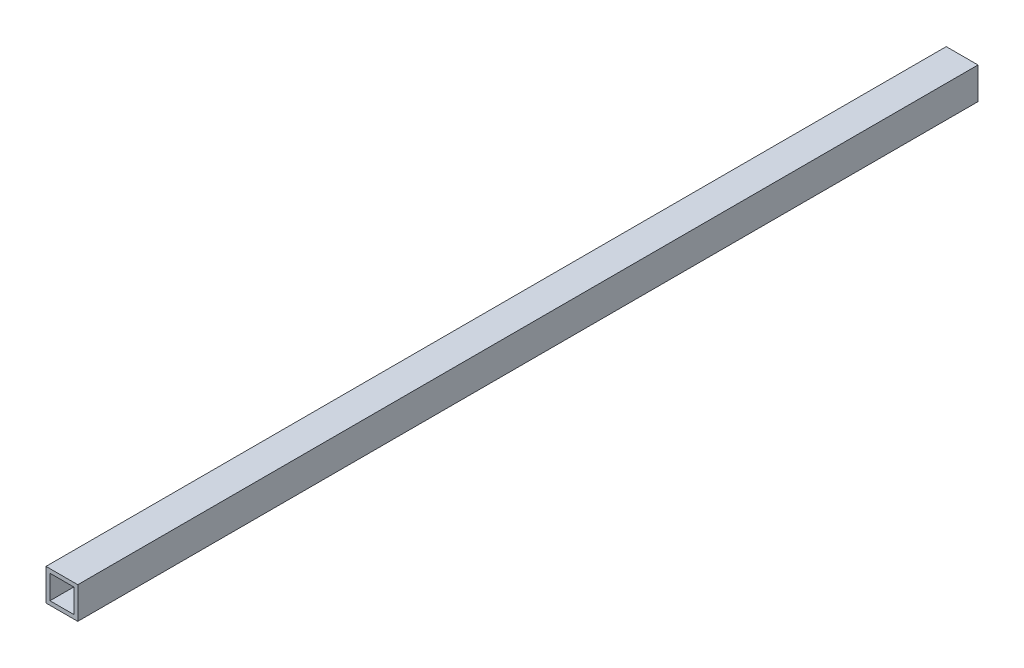
ISO-10303-21;
HEADER;
FILE_DESCRIPTION(('STEP AP214'),'2;1');
FILE_NAME('part.step','',(''),(''),'','','');
FILE_SCHEMA(('AUTOMOTIVE_DESIGN { 1 0 10303 214 1 1 1 1 }'));
ENDSEC;
DATA;
#1=APPLICATION_CONTEXT('core data for automotive mechanical design processes');
#2=APPLICATION_PROTOCOL_DEFINITION('international standard','automotive_design',2000,#1);
#3=PRODUCT_CONTEXT('',#1,'mechanical');
#4=PRODUCT('Part','Part','',(#3));
#5=PRODUCT_RELATED_PRODUCT_CATEGORY('part','',(#4));
#6=PRODUCT_DEFINITION_FORMATION('','',#4);
#7=PRODUCT_DEFINITION_CONTEXT('part definition',#1,'design');
#8=PRODUCT_DEFINITION('design','',#6,#7);
#9=PRODUCT_DEFINITION_SHAPE('','',#8);
#10=(LENGTH_UNIT() NAMED_UNIT(*) SI_UNIT(.MILLI.,.METRE.));
#11=(NAMED_UNIT(*) PLANE_ANGLE_UNIT() SI_UNIT($,.RADIAN.));
#12=(NAMED_UNIT(*) SI_UNIT($,.STERADIAN.) SOLID_ANGLE_UNIT());
#13=UNCERTAINTY_MEASURE_WITH_UNIT(LENGTH_MEASURE(1.E-05),#10,'distance_accuracy_value','');
#14=(GEOMETRIC_REPRESENTATION_CONTEXT(3) GLOBAL_UNCERTAINTY_ASSIGNED_CONTEXT((#13)) GLOBAL_UNIT_ASSIGNED_CONTEXT((#10,
#11,#12)) REPRESENTATION_CONTEXT('',''));
#15=CARTESIAN_POINT('',(0.,0.,0.));
#16=DIRECTION('',(0.,0.,1.));
#17=DIRECTION('',(1.,0.,0.));
#18=AXIS2_PLACEMENT_3D('',#15,#16,#17);
#19=CARTESIAN_POINT('',(6.,6.,340.));
#20=DIRECTION('',(-1.,0.,0.));
#21=DIRECTION('',(0.,-1.,0.));
#22=AXIS2_PLACEMENT_3D('',#19,#20,#21);
#23=PLANE('',#22);
#24=DIRECTION('',(0.,1.,0.));
#25=VECTOR('',#24,1.);
#26=CARTESIAN_POINT('',(6.,6.,0.));
#27=LINE('',#26,#25);
#28=CARTESIAN_POINT('',(6.,-6.,0.));
#29=VERTEX_POINT('',#28);
#30=CARTESIAN_POINT('',(6.,6.,0.));
#31=VERTEX_POINT('',#30);
#32=EDGE_CURVE('E149',#29,#31,#27,.T.);
#33=ORIENTED_EDGE('',*,*,#32,.T.);
#34=DIRECTION('',(0.,0.,-1.));
#35=VECTOR('',#34,1.);
#36=CARTESIAN_POINT('',(6.,6.,340.));
#37=LINE('',#36,#35);
#38=CARTESIAN_POINT('',(6.,6.,340.));
#39=VERTEX_POINT('',#38);
#40=EDGE_CURVE('E11',#39,#31,#37,.T.);
#41=ORIENTED_EDGE('',*,*,#40,.F.);
#42=DIRECTION('',(0.,1.,0.));
#43=VECTOR('',#42,1.);
#44=CARTESIAN_POINT('',(6.,6.,340.));
#45=LINE('',#44,#43);
#46=CARTESIAN_POINT('',(6.,-6.,340.));
#47=VERTEX_POINT('',#46);
#48=EDGE_CURVE('E138',#47,#39,#45,.T.);
#49=ORIENTED_EDGE('',*,*,#48,.F.);
#50=DIRECTION('',(0.,0.,-1.));
#51=VECTOR('',#50,1.);
#52=CARTESIAN_POINT('',(6.,-6.,340.));
#53=LINE('',#52,#51);
#54=EDGE_CURVE('E148',#47,#29,#53,.T.);
#55=ORIENTED_EDGE('',*,*,#54,.T.);
#56=EDGE_LOOP('',(#33,#41,#49,#55));
#57=FACE_BOUND('',#56,.T.);
#58=ADVANCED_FACE('F41',(#57),#23,.F.);
#59=CARTESIAN_POINT('',(-6.,6.,340.));
#60=DIRECTION('',(0.,-1.,0.));
#61=DIRECTION('',(0.,0.,-1.));
#62=AXIS2_PLACEMENT_3D('',#59,#60,#61);
#63=PLANE('',#62);
#64=DIRECTION('',(-1.,0.,0.));
#65=VECTOR('',#64,1.);
#66=CARTESIAN_POINT('',(-6.,6.,0.));
#67=LINE('',#66,#65);
#68=CARTESIAN_POINT('',(-6.,6.,0.));
#69=VERTEX_POINT('',#68);
#70=EDGE_CURVE('E152',#31,#69,#67,.T.);
#71=ORIENTED_EDGE('',*,*,#70,.T.);
#72=DIRECTION('',(0.,0.,-1.));
#73=VECTOR('',#72,1.);
#74=CARTESIAN_POINT('',(-6.,6.,340.));
#75=LINE('',#74,#73);
#76=CARTESIAN_POINT('',(-6.,6.,340.));
#77=VERTEX_POINT('',#76);
#78=EDGE_CURVE('E48',#77,#69,#75,.T.);
#79=ORIENTED_EDGE('',*,*,#78,.F.);
#80=DIRECTION('',(-1.,0.,0.));
#81=VECTOR('',#80,1.);
#82=CARTESIAN_POINT('',(-6.,6.,340.));
#83=LINE('',#82,#81);
#84=EDGE_CURVE('E141',#39,#77,#83,.T.);
#85=ORIENTED_EDGE('',*,*,#84,.F.);
#86=ORIENTED_EDGE('',*,*,#40,.T.);
#87=EDGE_LOOP('',(#71,#79,#85,#86));
#88=FACE_BOUND('',#87,.T.);
#89=ADVANCED_FACE('F180',(#88),#63,.F.);
#90=CARTESIAN_POINT('',(-6.,6.,340.));
#91=DIRECTION('',(1.,0.,0.));
#92=DIRECTION('',(0.,1.,0.));
#93=AXIS2_PLACEMENT_3D('',#90,#91,#92);
#94=PLANE('',#93);
#95=DIRECTION('',(0.,-1.,0.));
#96=VECTOR('',#95,1.);
#97=CARTESIAN_POINT('',(-6.,6.,0.));
#98=LINE('',#97,#96);
#99=CARTESIAN_POINT('',(-6.,-6.,0.));
#100=VERTEX_POINT('',#99);
#101=EDGE_CURVE('E154',#69,#100,#98,.T.);
#102=ORIENTED_EDGE('',*,*,#101,.T.);
#103=DIRECTION('',(0.,0.,-1.));
#104=VECTOR('',#103,1.);
#105=CARTESIAN_POINT('',(-6.,-6.,340.));
#106=LINE('',#105,#104);
#107=CARTESIAN_POINT('',(-6.,-6.,340.));
#108=VERTEX_POINT('',#107);
#109=EDGE_CURVE('E159',#108,#100,#106,.T.);
#110=ORIENTED_EDGE('',*,*,#109,.F.);
#111=DIRECTION('',(0.,-1.,0.));
#112=VECTOR('',#111,1.);
#113=CARTESIAN_POINT('',(-6.,6.,340.));
#114=LINE('',#113,#112);
#115=EDGE_CURVE('E144',#77,#108,#114,.T.);
#116=ORIENTED_EDGE('',*,*,#115,.F.);
#117=ORIENTED_EDGE('',*,*,#78,.T.);
#118=EDGE_LOOP('',(#102,#110,#116,#117));
#119=FACE_BOUND('',#118,.T.);
#120=ADVANCED_FACE('F166',(#119),#94,.F.);
#121=CARTESIAN_POINT('',(-6.,-6.,340.));
#122=DIRECTION('',(0.,1.,0.));
#123=DIRECTION('',(0.,0.,1.));
#124=AXIS2_PLACEMENT_3D('',#121,#122,#123);
#125=PLANE('',#124);
#126=DIRECTION('',(1.,0.,0.));
#127=VECTOR('',#126,1.);
#128=CARTESIAN_POINT('',(-6.,-6.,0.));
#129=LINE('',#128,#127);
#130=EDGE_CURVE('E142',#100,#29,#129,.T.);
#131=ORIENTED_EDGE('',*,*,#130,.T.);
#132=ORIENTED_EDGE('',*,*,#54,.F.);
#133=DIRECTION('',(1.,0.,0.));
#134=VECTOR('',#133,1.);
#135=CARTESIAN_POINT('',(-6.,-6.,340.));
#136=LINE('',#135,#134);
#137=EDGE_CURVE('E146',#108,#47,#136,.T.);
#138=ORIENTED_EDGE('',*,*,#137,.F.);
#139=ORIENTED_EDGE('',*,*,#109,.T.);
#140=EDGE_LOOP('',(#131,#132,#138,#139));
#141=FACE_BOUND('',#140,.T.);
#142=ADVANCED_FACE('F173',(#141),#125,.F.);
#143=CARTESIAN_POINT('',(0.,0.,340.));
#144=DIRECTION('',(0.,0.,1.));
#145=DIRECTION('',(1.,0.,0.));
#146=AXIS2_PLACEMENT_3D('',#143,#144,#145);
#147=PLANE('',#146);
#148=DIRECTION('',(0.,1.,0.));
#149=VECTOR('',#148,1.);
#150=CARTESIAN_POINT('',(4.5,6.,340.));
#151=LINE('',#150,#149);
#152=CARTESIAN_POINT('',(4.5,-4.5,340.));
#153=VERTEX_POINT('',#152);
#154=CARTESIAN_POINT('',(4.5,4.5,340.));
#155=VERTEX_POINT('',#154);
#156=EDGE_CURVE('E126',#153,#155,#151,.T.);
#157=ORIENTED_EDGE('',*,*,#156,.F.);
#158=DIRECTION('',(1.,0.,0.));
#159=VECTOR('',#158,1.);
#160=CARTESIAN_POINT('',(-6.,-4.5,340.));
#161=LINE('',#160,#159);
#162=CARTESIAN_POINT('',(-4.5,-4.5,340.));
#163=VERTEX_POINT('',#162);
#164=EDGE_CURVE('E110',#163,#153,#161,.T.);
#165=ORIENTED_EDGE('',*,*,#164,.F.);
#166=DIRECTION('',(0.,-1.,0.));
#167=VECTOR('',#166,1.);
#168=CARTESIAN_POINT('',(-4.5,6.,340.));
#169=LINE('',#168,#167);
#170=CARTESIAN_POINT('',(-4.5,4.5,340.));
#171=VERTEX_POINT('',#170);
#172=EDGE_CURVE('E135',#171,#163,#169,.T.);
#173=ORIENTED_EDGE('',*,*,#172,.F.);
#174=DIRECTION('',(-1.,0.,0.));
#175=VECTOR('',#174,1.);
#176=CARTESIAN_POINT('',(-6.,4.5,340.));
#177=LINE('',#176,#175);
#178=EDGE_CURVE('E128',#155,#171,#177,.T.);
#179=ORIENTED_EDGE('',*,*,#178,.F.);
#180=EDGE_LOOP('',(#157,#165,#173,#179));
#181=FACE_BOUND('',#180,.T.);
#182=ORIENTED_EDGE('',*,*,#48,.T.);
#183=ORIENTED_EDGE('',*,*,#84,.T.);
#184=ORIENTED_EDGE('',*,*,#115,.T.);
#185=ORIENTED_EDGE('',*,*,#137,.T.);
#186=EDGE_LOOP('',(#182,#183,#184,#185));
#187=FACE_BOUND('',#186,.T.);
#188=ADVANCED_FACE('F179',(#181,#187),#147,.T.);
#189=CARTESIAN_POINT('',(0.,0.,0.));
#190=DIRECTION('',(0.,0.,1.));
#191=DIRECTION('',(1.,0.,0.));
#192=AXIS2_PLACEMENT_3D('',#189,#190,#191);
#193=PLANE('',#192);
#194=DIRECTION('',(1.,0.,0.));
#195=VECTOR('',#194,1.);
#196=CARTESIAN_POINT('',(-6.,-4.5,0.));
#197=LINE('',#196,#195);
#198=CARTESIAN_POINT('',(-4.5,-4.5,0.));
#199=VERTEX_POINT('',#198);
#200=CARTESIAN_POINT('',(4.5,-4.5,0.));
#201=VERTEX_POINT('',#200);
#202=EDGE_CURVE('E108',#199,#201,#197,.T.);
#203=ORIENTED_EDGE('',*,*,#202,.T.);
#204=DIRECTION('',(0.,1.,0.));
#205=VECTOR('',#204,1.);
#206=CARTESIAN_POINT('',(4.5,6.,0.));
#207=LINE('',#206,#205);
#208=CARTESIAN_POINT('',(4.5,4.5,0.));
#209=VERTEX_POINT('',#208);
#210=EDGE_CURVE('E116',#201,#209,#207,.T.);
#211=ORIENTED_EDGE('',*,*,#210,.T.);
#212=DIRECTION('',(-1.,0.,0.));
#213=VECTOR('',#212,1.);
#214=CARTESIAN_POINT('',(-6.,4.5,0.));
#215=LINE('',#214,#213);
#216=CARTESIAN_POINT('',(-4.5,4.5,0.));
#217=VERTEX_POINT('',#216);
#218=EDGE_CURVE('E122',#209,#217,#215,.T.);
#219=ORIENTED_EDGE('',*,*,#218,.T.);
#220=DIRECTION('',(0.,-1.,0.));
#221=VECTOR('',#220,1.);
#222=CARTESIAN_POINT('',(-4.5,6.,0.));
#223=LINE('',#222,#221);
#224=EDGE_CURVE('E62',#217,#199,#223,.T.);
#225=ORIENTED_EDGE('',*,*,#224,.T.);
#226=EDGE_LOOP('',(#203,#211,#219,#225));
#227=FACE_BOUND('',#226,.T.);
#228=ORIENTED_EDGE('',*,*,#32,.F.);
#229=ORIENTED_EDGE('',*,*,#130,.F.);
#230=ORIENTED_EDGE('',*,*,#101,.F.);
#231=ORIENTED_EDGE('',*,*,#70,.F.);
#232=EDGE_LOOP('',(#228,#229,#230,#231));
#233=FACE_BOUND('',#232,.T.);
#234=ADVANCED_FACE('F124',(#227,#233),#193,.F.);
#235=CARTESIAN_POINT('',(4.5,6.,340.));
#236=DIRECTION('',(-1.,0.,0.));
#237=DIRECTION('',(0.,-1.,0.));
#238=AXIS2_PLACEMENT_3D('',#235,#236,#237);
#239=PLANE('',#238);
#240=ORIENTED_EDGE('',*,*,#210,.F.);
#241=DIRECTION('',(0.,0.,-1.));
#242=VECTOR('',#241,1.);
#243=CARTESIAN_POINT('',(4.5,-4.5,340.));
#244=LINE('',#243,#242);
#245=EDGE_CURVE('E104',#153,#201,#244,.T.);
#246=ORIENTED_EDGE('',*,*,#245,.F.);
#247=ORIENTED_EDGE('',*,*,#156,.T.);
#248=DIRECTION('',(0.,0.,-1.));
#249=VECTOR('',#248,1.);
#250=CARTESIAN_POINT('',(4.5,4.5,340.));
#251=LINE('',#250,#249);
#252=EDGE_CURVE('E119',#155,#209,#251,.T.);
#253=ORIENTED_EDGE('',*,*,#252,.T.);
#254=EDGE_LOOP('',(#240,#246,#247,#253));
#255=FACE_BOUND('',#254,.T.);
#256=ADVANCED_FACE('F117',(#255),#239,.T.);
#257=CARTESIAN_POINT('',(-6.,4.5,340.));
#258=DIRECTION('',(0.,-1.,0.));
#259=DIRECTION('',(0.,0.,-1.));
#260=AXIS2_PLACEMENT_3D('',#257,#258,#259);
#261=PLANE('',#260);
#262=ORIENTED_EDGE('',*,*,#218,.F.);
#263=ORIENTED_EDGE('',*,*,#252,.F.);
#264=ORIENTED_EDGE('',*,*,#178,.T.);
#265=DIRECTION('',(0.,0.,-1.));
#266=VECTOR('',#265,1.);
#267=CARTESIAN_POINT('',(-4.5,4.5,340.));
#268=LINE('',#267,#266);
#269=EDGE_CURVE('E304',#171,#217,#268,.T.);
#270=ORIENTED_EDGE('',*,*,#269,.T.);
#271=EDGE_LOOP('',(#262,#263,#264,#270));
#272=FACE_BOUND('',#271,.T.);
#273=ADVANCED_FACE('F200',(#272),#261,.T.);
#274=CARTESIAN_POINT('',(-4.5,6.,340.));
#275=DIRECTION('',(1.,0.,0.));
#276=DIRECTION('',(0.,1.,0.));
#277=AXIS2_PLACEMENT_3D('',#274,#275,#276);
#278=PLANE('',#277);
#279=ORIENTED_EDGE('',*,*,#224,.F.);
#280=ORIENTED_EDGE('',*,*,#269,.F.);
#281=ORIENTED_EDGE('',*,*,#172,.T.);
#282=DIRECTION('',(0.,0.,-1.));
#283=VECTOR('',#282,1.);
#284=CARTESIAN_POINT('',(-4.5,-4.5,340.));
#285=LINE('',#284,#283);
#286=EDGE_CURVE('E55',#163,#199,#285,.T.);
#287=ORIENTED_EDGE('',*,*,#286,.T.);
#288=EDGE_LOOP('',(#279,#280,#281,#287));
#289=FACE_BOUND('',#288,.T.);
#290=ADVANCED_FACE('F197',(#289),#278,.T.);
#291=CARTESIAN_POINT('',(-6.,-4.5,340.));
#292=DIRECTION('',(0.,1.,0.));
#293=DIRECTION('',(0.,0.,1.));
#294=AXIS2_PLACEMENT_3D('',#291,#292,#293);
#295=PLANE('',#294);
#296=ORIENTED_EDGE('',*,*,#202,.F.);
#297=ORIENTED_EDGE('',*,*,#286,.F.);
#298=ORIENTED_EDGE('',*,*,#164,.T.);
#299=ORIENTED_EDGE('',*,*,#245,.T.);
#300=EDGE_LOOP('',(#296,#297,#298,#299));
#301=FACE_BOUND('',#300,.T.);
#302=ADVANCED_FACE('F106',(#301),#295,.T.);
#303=CLOSED_SHELL('',(#58,#89,#120,#142,#188,#234,#256,#273,#290,#302));
#304=MANIFOLD_SOLID_BREP('B2',#303);
#305=ADVANCED_BREP_SHAPE_REPRESENTATION('',(#18,#304),#14);
#306=SHAPE_DEFINITION_REPRESENTATION(#9,#305);
ENDSEC;
END-ISO-10303-21;
